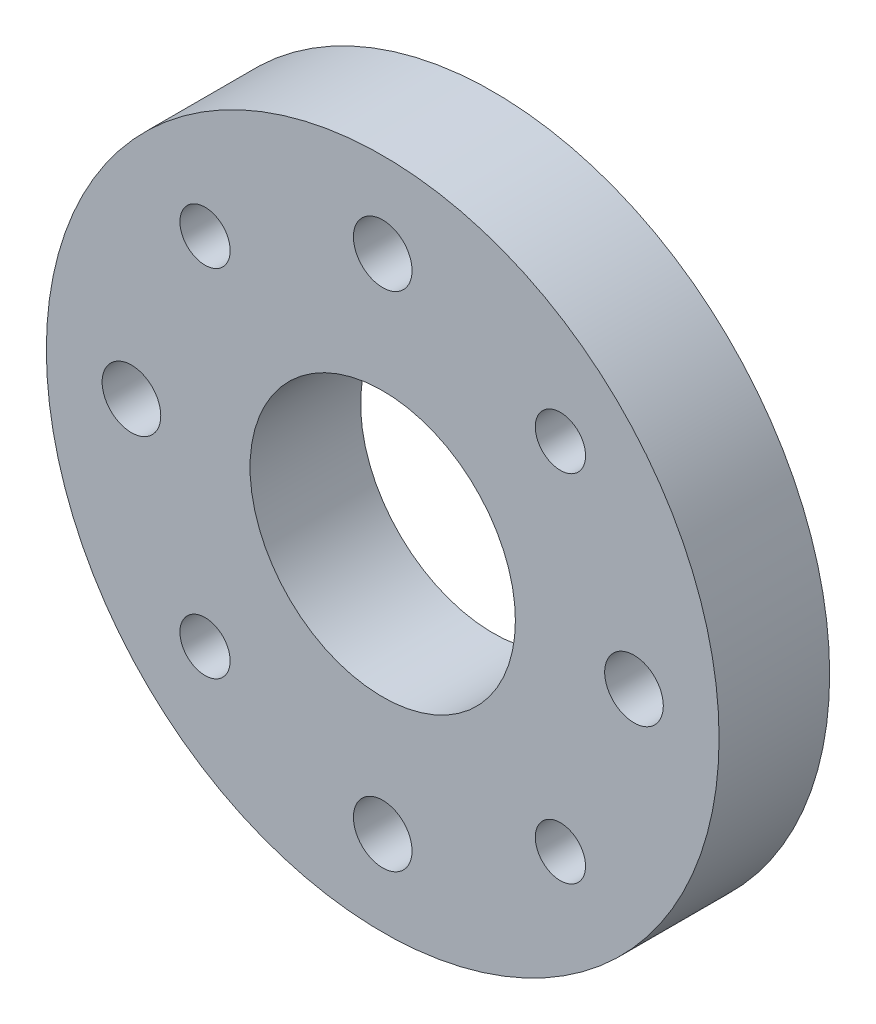
ISO-10303-21;
HEADER;
FILE_DESCRIPTION(('STEP AP214'),'2;1');
FILE_NAME('part.step','',(''),(''),'','','');
FILE_SCHEMA(('AUTOMOTIVE_DESIGN { 1 0 10303 214 1 1 1 1 }'));
ENDSEC;
DATA;
#1=APPLICATION_CONTEXT('core data for automotive mechanical design processes');
#2=APPLICATION_PROTOCOL_DEFINITION('international standard','automotive_design',2000,#1);
#3=PRODUCT_CONTEXT('',#1,'mechanical');
#4=PRODUCT('Part','Part','',(#3));
#5=PRODUCT_RELATED_PRODUCT_CATEGORY('part','',(#4));
#6=PRODUCT_DEFINITION_FORMATION('','',#4);
#7=PRODUCT_DEFINITION_CONTEXT('part definition',#1,'design');
#8=PRODUCT_DEFINITION('design','',#6,#7);
#9=PRODUCT_DEFINITION_SHAPE('','',#8);
#10=(LENGTH_UNIT() NAMED_UNIT(*) SI_UNIT(.MILLI.,.METRE.));
#11=(NAMED_UNIT(*) PLANE_ANGLE_UNIT() SI_UNIT($,.RADIAN.));
#12=(NAMED_UNIT(*) SI_UNIT($,.STERADIAN.) SOLID_ANGLE_UNIT());
#13=UNCERTAINTY_MEASURE_WITH_UNIT(LENGTH_MEASURE(1.E-05),#10,'distance_accuracy_value','');
#14=(GEOMETRIC_REPRESENTATION_CONTEXT(3) GLOBAL_UNCERTAINTY_ASSIGNED_CONTEXT((#13)) GLOBAL_UNIT_ASSIGNED_CONTEXT((#10,
#11,#12)) REPRESENTATION_CONTEXT('',''));
#15=CARTESIAN_POINT('',(0.,0.,0.));
#16=DIRECTION('',(0.,0.,1.));
#17=DIRECTION('',(1.,0.,0.));
#18=AXIS2_PLACEMENT_3D('',#15,#16,#17);
#19=CARTESIAN_POINT('',(0.,0.,6.6));
#20=DIRECTION('',(0.,0.,1.));
#21=DIRECTION('',(1.,0.,0.));
#22=AXIS2_PLACEMENT_3D('',#19,#20,#21);
#23=PLANE('',#22);
#24=CARTESIAN_POINT('',(-15.,1.53647213295987E-13,6.6));
#25=DIRECTION('',(0.,0.,1.));
#26=DIRECTION('',(1.,0.,0.));
#27=AXIS2_PLACEMENT_3D('',#24,#25,#26);
#28=CIRCLE('',#27,1.75);
#29=CARTESIAN_POINT('',(-13.25,1.53647213295987E-13,6.6));
#30=VERTEX_POINT('',#29);
#31=EDGE_CURVE('E83',#30,#30,#28,.T.);
#32=ORIENTED_EDGE('',*,*,#31,.F.);
#33=EDGE_LOOP('',(#32));
#34=FACE_BOUND('',#33,.T.);
#35=CARTESIAN_POINT('',(3.78271964485688E-13,-15.0000000000001,6.6));
#36=DIRECTION('',(0.,0.,1.));
#37=DIRECTION('',(1.,0.,0.));
#38=AXIS2_PLACEMENT_3D('',#35,#36,#37);
#39=CIRCLE('',#38,1.75);
#40=CARTESIAN_POINT('',(1.75000000000038,-15.0000000000001,6.6));
#41=VERTEX_POINT('',#40);
#42=EDGE_CURVE('E71',#41,#41,#39,.T.);
#43=ORIENTED_EDGE('',*,*,#42,.F.);
#44=EDGE_LOOP('',(#43));
#45=FACE_BOUND('',#44,.T.);
#46=CARTESIAN_POINT('',(15.,0.,6.6));
#47=DIRECTION('',(0.,0.,1.));
#48=DIRECTION('',(1.,0.,0.));
#49=AXIS2_PLACEMENT_3D('',#46,#47,#48);
#50=CIRCLE('',#49,1.75);
#51=CARTESIAN_POINT('',(16.75,0.,6.6));
#52=VERTEX_POINT('',#51);
#53=EDGE_CURVE('E59',#52,#52,#50,.T.);
#54=ORIENTED_EDGE('',*,*,#53,.F.);
#55=EDGE_LOOP('',(#54));
#56=FACE_BOUND('',#55,.T.);
#57=CARTESIAN_POINT('',(0.,15.,6.6));
#58=DIRECTION('',(0.,0.,1.));
#59=DIRECTION('',(1.,0.,0.));
#60=AXIS2_PLACEMENT_3D('',#57,#58,#59);
#61=CIRCLE('',#60,1.75);
#62=CARTESIAN_POINT('',(1.75,15.,6.6));
#63=VERTEX_POINT('',#62);
#64=EDGE_CURVE('E47',#63,#63,#61,.T.);
#65=ORIENTED_EDGE('',*,*,#64,.F.);
#66=EDGE_LOOP('',(#65));
#67=FACE_BOUND('',#66,.T.);
#68=CARTESIAN_POINT('',(0.,0.,6.6));
#69=DIRECTION('',(0.,0.,1.));
#70=DIRECTION('',(1.,0.,0.));
#71=AXIS2_PLACEMENT_3D('',#68,#69,#70);
#72=CIRCLE('',#71,20.08);
#73=CARTESIAN_POINT('',(20.08,0.,6.6));
#74=VERTEX_POINT('',#73);
#75=EDGE_CURVE('E11',#74,#74,#72,.T.);
#76=ORIENTED_EDGE('',*,*,#75,.T.);
#77=EDGE_LOOP('',(#76));
#78=FACE_BOUND('',#77,.T.);
#79=CARTESIAN_POINT('',(0.,0.,6.6));
#80=DIRECTION('',(0.,0.,1.));
#81=DIRECTION('',(1.,0.,0.));
#82=AXIS2_PLACEMENT_3D('',#79,#80,#81);
#83=CIRCLE('',#82,7.92);
#84=CARTESIAN_POINT('',(7.92,0.,6.6));
#85=VERTEX_POINT('',#84);
#86=EDGE_CURVE('E42',#85,#85,#83,.T.);
#87=ORIENTED_EDGE('',*,*,#86,.F.);
#88=EDGE_LOOP('',(#87));
#89=FACE_BOUND('',#88,.T.);
#90=CARTESIAN_POINT('',(10.6066017177982,10.6066017177982,6.6));
#91=DIRECTION('',(0.,0.,1.));
#92=DIRECTION('',(1.,0.,0.));
#93=AXIS2_PLACEMENT_3D('',#90,#91,#92);
#94=CIRCLE('',#93,1.5);
#95=CARTESIAN_POINT('',(12.1066017177982,10.6066017177982,6.6));
#96=VERTEX_POINT('',#95);
#97=EDGE_CURVE('E53',#96,#96,#94,.T.);
#98=ORIENTED_EDGE('',*,*,#97,.F.);
#99=EDGE_LOOP('',(#98));
#100=FACE_BOUND('',#99,.T.);
#101=CARTESIAN_POINT('',(10.6066017177982,-10.6066017177983,6.6));
#102=DIRECTION('',(0.,0.,1.));
#103=DIRECTION('',(1.,0.,0.));
#104=AXIS2_PLACEMENT_3D('',#101,#102,#103);
#105=CIRCLE('',#104,1.5);
#106=CARTESIAN_POINT('',(12.1066017177982,-10.6066017177983,6.6));
#107=VERTEX_POINT('',#106);
#108=EDGE_CURVE('E65',#107,#107,#105,.T.);
#109=ORIENTED_EDGE('',*,*,#108,.F.);
#110=EDGE_LOOP('',(#109));
#111=FACE_BOUND('',#110,.T.);
#112=CARTESIAN_POINT('',(-10.6066017177979,-10.6066017177983,6.6));
#113=DIRECTION('',(0.,0.,1.));
#114=DIRECTION('',(1.,0.,0.));
#115=AXIS2_PLACEMENT_3D('',#112,#113,#114);
#116=CIRCLE('',#115,1.5);
#117=CARTESIAN_POINT('',(-9.10660171779785,-10.6066017177983,6.6));
#118=VERTEX_POINT('',#117);
#119=EDGE_CURVE('E77',#118,#118,#116,.T.);
#120=ORIENTED_EDGE('',*,*,#119,.F.);
#121=EDGE_LOOP('',(#120));
#122=FACE_BOUND('',#121,.T.);
#123=CARTESIAN_POINT('',(-10.6066017177981,10.6066017177983,6.6));
#124=DIRECTION('',(0.,0.,1.));
#125=DIRECTION('',(1.,0.,0.));
#126=AXIS2_PLACEMENT_3D('',#123,#124,#125);
#127=CIRCLE('',#126,1.5);
#128=CARTESIAN_POINT('',(-9.10660171779808,10.6066017177983,6.6));
#129=VERTEX_POINT('',#128);
#130=EDGE_CURVE('E89',#129,#129,#127,.T.);
#131=ORIENTED_EDGE('',*,*,#130,.F.);
#132=EDGE_LOOP('',(#131));
#133=FACE_BOUND('',#132,.T.);
#134=ADVANCED_FACE('F31',(#34,#45,#56,#67,#78,#89,#100,#111,#122,#133),#23,.T.);
#135=CARTESIAN_POINT('',(0.,0.,0.));
#136=DIRECTION('',(0.,0.,1.));
#137=DIRECTION('',(1.,0.,0.));
#138=AXIS2_PLACEMENT_3D('',#135,#136,#137);
#139=PLANE('',#138);
#140=CARTESIAN_POINT('',(-15.,1.53647213295987E-13,0.));
#141=DIRECTION('',(0.,0.,1.));
#142=DIRECTION('',(1.,0.,0.));
#143=AXIS2_PLACEMENT_3D('',#140,#141,#142);
#144=CIRCLE('',#143,1.75);
#145=CARTESIAN_POINT('',(-13.25,1.53647213295987E-13,0.));
#146=VERTEX_POINT('',#145);
#147=EDGE_CURVE('E86',#146,#146,#144,.T.);
#148=ORIENTED_EDGE('',*,*,#147,.T.);
#149=EDGE_LOOP('',(#148));
#150=FACE_BOUND('',#149,.T.);
#151=CARTESIAN_POINT('',(3.78271964485688E-13,-15.0000000000001,0.));
#152=DIRECTION('',(0.,0.,1.));
#153=DIRECTION('',(1.,0.,0.));
#154=AXIS2_PLACEMENT_3D('',#151,#152,#153);
#155=CIRCLE('',#154,1.75);
#156=CARTESIAN_POINT('',(1.75000000000038,-15.0000000000001,0.));
#157=VERTEX_POINT('',#156);
#158=EDGE_CURVE('E74',#157,#157,#155,.T.);
#159=ORIENTED_EDGE('',*,*,#158,.T.);
#160=EDGE_LOOP('',(#159));
#161=FACE_BOUND('',#160,.T.);
#162=CARTESIAN_POINT('',(15.,0.,0.));
#163=DIRECTION('',(0.,0.,1.));
#164=DIRECTION('',(1.,0.,0.));
#165=AXIS2_PLACEMENT_3D('',#162,#163,#164);
#166=CIRCLE('',#165,1.75);
#167=CARTESIAN_POINT('',(16.75,0.,0.));
#168=VERTEX_POINT('',#167);
#169=EDGE_CURVE('E62',#168,#168,#166,.T.);
#170=ORIENTED_EDGE('',*,*,#169,.T.);
#171=EDGE_LOOP('',(#170));
#172=FACE_BOUND('',#171,.T.);
#173=CARTESIAN_POINT('',(0.,15.,0.));
#174=DIRECTION('',(0.,0.,1.));
#175=DIRECTION('',(1.,0.,0.));
#176=AXIS2_PLACEMENT_3D('',#173,#174,#175);
#177=CIRCLE('',#176,1.75);
#178=CARTESIAN_POINT('',(1.75,15.,0.));
#179=VERTEX_POINT('',#178);
#180=EDGE_CURVE('E50',#179,#179,#177,.T.);
#181=ORIENTED_EDGE('',*,*,#180,.T.);
#182=EDGE_LOOP('',(#181));
#183=FACE_BOUND('',#182,.T.);
#184=CARTESIAN_POINT('',(0.,0.,0.));
#185=DIRECTION('',(0.,0.,1.));
#186=DIRECTION('',(1.,0.,0.));
#187=AXIS2_PLACEMENT_3D('',#184,#185,#186);
#188=CIRCLE('',#187,20.08);
#189=CARTESIAN_POINT('',(20.08,0.,0.));
#190=VERTEX_POINT('',#189);
#191=EDGE_CURVE('E35',#190,#190,#188,.T.);
#192=ORIENTED_EDGE('',*,*,#191,.F.);
#193=EDGE_LOOP('',(#192));
#194=FACE_BOUND('',#193,.T.);
#195=CARTESIAN_POINT('',(0.,0.,0.));
#196=DIRECTION('',(0.,0.,1.));
#197=DIRECTION('',(1.,0.,0.));
#198=AXIS2_PLACEMENT_3D('',#195,#196,#197);
#199=CIRCLE('',#198,7.92);
#200=CARTESIAN_POINT('',(7.92,0.,0.));
#201=VERTEX_POINT('',#200);
#202=EDGE_CURVE('E44',#201,#201,#199,.T.);
#203=ORIENTED_EDGE('',*,*,#202,.T.);
#204=EDGE_LOOP('',(#203));
#205=FACE_BOUND('',#204,.T.);
#206=CARTESIAN_POINT('',(10.6066017177982,10.6066017177982,0.));
#207=DIRECTION('',(0.,0.,1.));
#208=DIRECTION('',(1.,0.,0.));
#209=AXIS2_PLACEMENT_3D('',#206,#207,#208);
#210=CIRCLE('',#209,1.5);
#211=CARTESIAN_POINT('',(12.1066017177982,10.6066017177982,0.));
#212=VERTEX_POINT('',#211);
#213=EDGE_CURVE('E56',#212,#212,#210,.T.);
#214=ORIENTED_EDGE('',*,*,#213,.T.);
#215=EDGE_LOOP('',(#214));
#216=FACE_BOUND('',#215,.T.);
#217=CARTESIAN_POINT('',(10.6066017177982,-10.6066017177983,0.));
#218=DIRECTION('',(0.,0.,1.));
#219=DIRECTION('',(1.,0.,0.));
#220=AXIS2_PLACEMENT_3D('',#217,#218,#219);
#221=CIRCLE('',#220,1.5);
#222=CARTESIAN_POINT('',(12.1066017177982,-10.6066017177983,0.));
#223=VERTEX_POINT('',#222);
#224=EDGE_CURVE('E68',#223,#223,#221,.T.);
#225=ORIENTED_EDGE('',*,*,#224,.T.);
#226=EDGE_LOOP('',(#225));
#227=FACE_BOUND('',#226,.T.);
#228=CARTESIAN_POINT('',(-10.6066017177979,-10.6066017177983,0.));
#229=DIRECTION('',(0.,0.,1.));
#230=DIRECTION('',(1.,0.,0.));
#231=AXIS2_PLACEMENT_3D('',#228,#229,#230);
#232=CIRCLE('',#231,1.5);
#233=CARTESIAN_POINT('',(-9.10660171779785,-10.6066017177983,0.));
#234=VERTEX_POINT('',#233);
#235=EDGE_CURVE('E80',#234,#234,#232,.T.);
#236=ORIENTED_EDGE('',*,*,#235,.T.);
#237=EDGE_LOOP('',(#236));
#238=FACE_BOUND('',#237,.T.);
#239=CARTESIAN_POINT('',(-10.6066017177981,10.6066017177983,0.));
#240=DIRECTION('',(0.,0.,1.));
#241=DIRECTION('',(1.,0.,0.));
#242=AXIS2_PLACEMENT_3D('',#239,#240,#241);
#243=CIRCLE('',#242,1.5);
#244=CARTESIAN_POINT('',(-9.10660171779808,10.6066017177983,0.));
#245=VERTEX_POINT('',#244);
#246=EDGE_CURVE('E92',#245,#245,#243,.T.);
#247=ORIENTED_EDGE('',*,*,#246,.T.);
#248=EDGE_LOOP('',(#247));
#249=FACE_BOUND('',#248,.T.);
#250=ADVANCED_FACE('F102',(#150,#161,#172,#183,#194,#205,#216,#227,#238,#249),#139,.F.);
#251=CARTESIAN_POINT('',(0.,0.,6.6));
#252=DIRECTION('',(0.,0.,-1.));
#253=DIRECTION('',(-1.,0.,0.));
#254=AXIS2_PLACEMENT_3D('',#251,#252,#253);
#255=CYLINDRICAL_SURFACE('',#254,20.08);
#256=ORIENTED_EDGE('',*,*,#75,.F.);
#257=EDGE_LOOP('',(#256));
#258=FACE_BOUND('',#257,.T.);
#259=ORIENTED_EDGE('',*,*,#191,.T.);
#260=EDGE_LOOP('',(#259));
#261=FACE_BOUND('',#260,.T.);
#262=ADVANCED_FACE('F33',(#258,#261),#255,.T.);
#263=CARTESIAN_POINT('',(0.,0.,6.6));
#264=DIRECTION('',(0.,0.,-1.));
#265=DIRECTION('',(-1.,0.,0.));
#266=AXIS2_PLACEMENT_3D('',#263,#264,#265);
#267=CYLINDRICAL_SURFACE('',#266,7.92);
#268=ORIENTED_EDGE('',*,*,#86,.T.);
#269=EDGE_LOOP('',(#268));
#270=FACE_BOUND('',#269,.T.);
#271=ORIENTED_EDGE('',*,*,#202,.F.);
#272=EDGE_LOOP('',(#271));
#273=FACE_BOUND('',#272,.T.);
#274=ADVANCED_FACE('F115',(#270,#273),#267,.F.);
#275=CARTESIAN_POINT('',(0.,15.,6.6));
#276=DIRECTION('',(0.,0.,-1.));
#277=DIRECTION('',(-1.,0.,0.));
#278=AXIS2_PLACEMENT_3D('',#275,#276,#277);
#279=CYLINDRICAL_SURFACE('',#278,1.75);
#280=ORIENTED_EDGE('',*,*,#64,.T.);
#281=EDGE_LOOP('',(#280));
#282=FACE_BOUND('',#281,.T.);
#283=ORIENTED_EDGE('',*,*,#180,.F.);
#284=EDGE_LOOP('',(#283));
#285=FACE_BOUND('',#284,.T.);
#286=ADVANCED_FACE('F113',(#282,#285),#279,.F.);
#287=CARTESIAN_POINT('',(10.6066017177982,10.6066017177982,6.6));
#288=DIRECTION('',(0.,0.,-1.));
#289=DIRECTION('',(-1.,0.,0.));
#290=AXIS2_PLACEMENT_3D('',#287,#288,#289);
#291=CYLINDRICAL_SURFACE('',#290,1.5);
#292=ORIENTED_EDGE('',*,*,#97,.T.);
#293=EDGE_LOOP('',(#292));
#294=FACE_BOUND('',#293,.T.);
#295=ORIENTED_EDGE('',*,*,#213,.F.);
#296=EDGE_LOOP('',(#295));
#297=FACE_BOUND('',#296,.T.);
#298=ADVANCED_FACE('F122',(#294,#297),#291,.F.);
#299=CARTESIAN_POINT('',(15.,0.,6.6));
#300=DIRECTION('',(0.,0.,-1.));
#301=DIRECTION('',(-1.,0.,0.));
#302=AXIS2_PLACEMENT_3D('',#299,#300,#301);
#303=CYLINDRICAL_SURFACE('',#302,1.75);
#304=ORIENTED_EDGE('',*,*,#53,.T.);
#305=EDGE_LOOP('',(#304));
#306=FACE_BOUND('',#305,.T.);
#307=ORIENTED_EDGE('',*,*,#169,.F.);
#308=EDGE_LOOP('',(#307));
#309=FACE_BOUND('',#308,.T.);
#310=ADVANCED_FACE('F157',(#306,#309),#303,.F.);
#311=CARTESIAN_POINT('',(10.6066017177982,-10.6066017177983,6.6));
#312=DIRECTION('',(0.,0.,-1.));
#313=DIRECTION('',(-1.,0.,0.));
#314=AXIS2_PLACEMENT_3D('',#311,#312,#313);
#315=CYLINDRICAL_SURFACE('',#314,1.5);
#316=ORIENTED_EDGE('',*,*,#108,.T.);
#317=EDGE_LOOP('',(#316));
#318=FACE_BOUND('',#317,.T.);
#319=ORIENTED_EDGE('',*,*,#224,.F.);
#320=EDGE_LOOP('',(#319));
#321=FACE_BOUND('',#320,.T.);
#322=ADVANCED_FACE('F153',(#318,#321),#315,.F.);
#323=CARTESIAN_POINT('',(3.78271964485688E-13,-15.0000000000001,6.6));
#324=DIRECTION('',(0.,0.,-1.));
#325=DIRECTION('',(-1.,0.,0.));
#326=AXIS2_PLACEMENT_3D('',#323,#324,#325);
#327=CYLINDRICAL_SURFACE('',#326,1.75);
#328=ORIENTED_EDGE('',*,*,#42,.T.);
#329=EDGE_LOOP('',(#328));
#330=FACE_BOUND('',#329,.T.);
#331=ORIENTED_EDGE('',*,*,#158,.F.);
#332=EDGE_LOOP('',(#331));
#333=FACE_BOUND('',#332,.T.);
#334=ADVANCED_FACE('F149',(#330,#333),#327,.F.);
#335=CARTESIAN_POINT('',(-10.6066017177979,-10.6066017177983,6.6));
#336=DIRECTION('',(0.,0.,-1.));
#337=DIRECTION('',(-1.,0.,0.));
#338=AXIS2_PLACEMENT_3D('',#335,#336,#337);
#339=CYLINDRICAL_SURFACE('',#338,1.5);
#340=ORIENTED_EDGE('',*,*,#119,.T.);
#341=EDGE_LOOP('',(#340));
#342=FACE_BOUND('',#341,.T.);
#343=ORIENTED_EDGE('',*,*,#235,.F.);
#344=EDGE_LOOP('',(#343));
#345=FACE_BOUND('',#344,.T.);
#346=ADVANCED_FACE('F143',(#342,#345),#339,.F.);
#347=CARTESIAN_POINT('',(-15.,1.53647213295987E-13,6.6));
#348=DIRECTION('',(0.,0.,-1.));
#349=DIRECTION('',(-1.,0.,0.));
#350=AXIS2_PLACEMENT_3D('',#347,#348,#349);
#351=CYLINDRICAL_SURFACE('',#350,1.75);
#352=ORIENTED_EDGE('',*,*,#31,.T.);
#353=EDGE_LOOP('',(#352));
#354=FACE_BOUND('',#353,.T.);
#355=ORIENTED_EDGE('',*,*,#147,.F.);
#356=EDGE_LOOP('',(#355));
#357=FACE_BOUND('',#356,.T.);
#358=ADVANCED_FACE('F138',(#354,#357),#351,.F.);
#359=CARTESIAN_POINT('',(-10.6066017177981,10.6066017177983,6.6));
#360=DIRECTION('',(0.,0.,-1.));
#361=DIRECTION('',(-1.,0.,0.));
#362=AXIS2_PLACEMENT_3D('',#359,#360,#361);
#363=CYLINDRICAL_SURFACE('',#362,1.5);
#364=ORIENTED_EDGE('',*,*,#130,.T.);
#365=EDGE_LOOP('',(#364));
#366=FACE_BOUND('',#365,.T.);
#367=ORIENTED_EDGE('',*,*,#246,.F.);
#368=EDGE_LOOP('',(#367));
#369=FACE_BOUND('',#368,.T.);
#370=ADVANCED_FACE('F98',(#366,#369),#363,.F.);
#371=CLOSED_SHELL('',(#134,#250,#262,#274,#286,#298,#310,#322,#334,#346,#358,#370));
#372=MANIFOLD_SOLID_BREP('B2',#371);
#373=ADVANCED_BREP_SHAPE_REPRESENTATION('',(#18,#372),#14);
#374=SHAPE_DEFINITION_REPRESENTATION(#9,#373);
ENDSEC;
END-ISO-10303-21;
